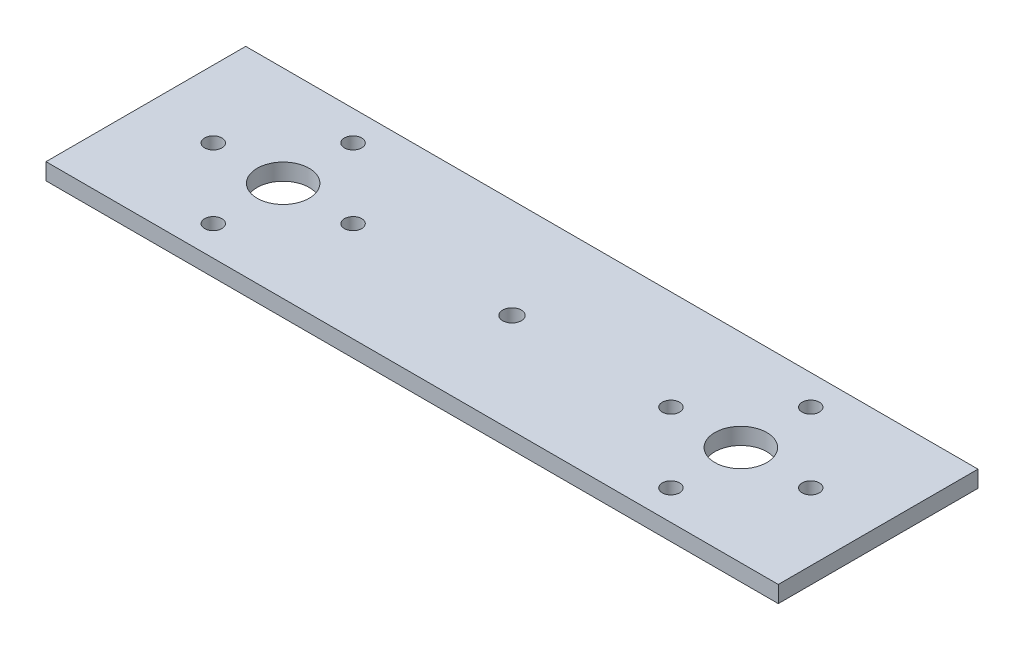
ISO-10303-21;
HEADER;
FILE_DESCRIPTION(('STEP AP214'),'2;1');
FILE_NAME('part.step','',(''),(''),'','','');
FILE_SCHEMA(('AUTOMOTIVE_DESIGN { 1 0 10303 214 1 1 1 1 }'));
ENDSEC;
DATA;
#1=APPLICATION_CONTEXT('core data for automotive mechanical design processes');
#2=APPLICATION_PROTOCOL_DEFINITION('international standard','automotive_design',2000,#1);
#3=PRODUCT_CONTEXT('',#1,'mechanical');
#4=PRODUCT('Part','Part','',(#3));
#5=PRODUCT_RELATED_PRODUCT_CATEGORY('part','',(#4));
#6=PRODUCT_DEFINITION_FORMATION('','',#4);
#7=PRODUCT_DEFINITION_CONTEXT('part definition',#1,'design');
#8=PRODUCT_DEFINITION('design','',#6,#7);
#9=PRODUCT_DEFINITION_SHAPE('','',#8);
#10=(LENGTH_UNIT() NAMED_UNIT(*) SI_UNIT(.MILLI.,.METRE.));
#11=(NAMED_UNIT(*) PLANE_ANGLE_UNIT() SI_UNIT($,.RADIAN.));
#12=(NAMED_UNIT(*) SI_UNIT($,.STERADIAN.) SOLID_ANGLE_UNIT());
#13=UNCERTAINTY_MEASURE_WITH_UNIT(LENGTH_MEASURE(1.E-05),#10,'distance_accuracy_value','');
#14=(GEOMETRIC_REPRESENTATION_CONTEXT(3) GLOBAL_UNCERTAINTY_ASSIGNED_CONTEXT((#13)) GLOBAL_UNIT_ASSIGNED_CONTEXT((#10,
#11,#12)) REPRESENTATION_CONTEXT('',''));
#15=CARTESIAN_POINT('',(0.,0.,0.));
#16=DIRECTION('',(0.,0.,1.));
#17=DIRECTION('',(1.,0.,0.));
#18=AXIS2_PLACEMENT_3D('',#15,#16,#17);
#19=CARTESIAN_POINT('',(139.7,6.35,38.1));
#20=DIRECTION('',(-1.,0.,0.));
#21=DIRECTION('',(0.,0.,1.));
#22=AXIS2_PLACEMENT_3D('',#19,#20,#21);
#23=PLANE('',#22);
#24=DIRECTION('',(0.,0.,-1.));
#25=VECTOR('',#24,1.);
#26=CARTESIAN_POINT('',(139.7,0.,38.1));
#27=LINE('',#26,#25);
#28=CARTESIAN_POINT('',(139.7,0.,38.1));
#29=VERTEX_POINT('',#28);
#30=CARTESIAN_POINT('',(139.7,0.,-38.1));
#31=VERTEX_POINT('',#30);
#32=EDGE_CURVE('E97',#29,#31,#27,.T.);
#33=ORIENTED_EDGE('',*,*,#32,.T.);
#34=DIRECTION('',(0.,-1.,0.));
#35=VECTOR('',#34,1.);
#36=CARTESIAN_POINT('',(139.7,6.35,-38.1));
#37=LINE('',#36,#35);
#38=CARTESIAN_POINT('',(139.7,6.35,-38.1));
#39=VERTEX_POINT('',#38);
#40=EDGE_CURVE('E11',#39,#31,#37,.T.);
#41=ORIENTED_EDGE('',*,*,#40,.F.);
#42=DIRECTION('',(0.,0.,-1.));
#43=VECTOR('',#42,1.);
#44=CARTESIAN_POINT('',(139.7,6.35,38.1));
#45=LINE('',#44,#43);
#46=CARTESIAN_POINT('',(139.7,6.35,38.1));
#47=VERTEX_POINT('',#46);
#48=EDGE_CURVE('E85',#47,#39,#45,.T.);
#49=ORIENTED_EDGE('',*,*,#48,.F.);
#50=DIRECTION('',(0.,-1.,0.));
#51=VECTOR('',#50,1.);
#52=CARTESIAN_POINT('',(139.7,6.35,38.1));
#53=LINE('',#52,#51);
#54=EDGE_CURVE('E93',#47,#29,#53,.T.);
#55=ORIENTED_EDGE('',*,*,#54,.T.);
#56=EDGE_LOOP('',(#33,#41,#49,#55));
#57=FACE_BOUND('',#56,.T.);
#58=ADVANCED_FACE('F34',(#57),#23,.F.);
#59=CARTESIAN_POINT('',(-139.7,6.35,-38.1));
#60=DIRECTION('',(0.,0.,1.));
#61=DIRECTION('',(1.,0.,0.));
#62=AXIS2_PLACEMENT_3D('',#59,#60,#61);
#63=PLANE('',#62);
#64=DIRECTION('',(-1.,0.,0.));
#65=VECTOR('',#64,1.);
#66=CARTESIAN_POINT('',(-139.7,0.,-38.1));
#67=LINE('',#66,#65);
#68=CARTESIAN_POINT('',(-139.7,0.,-38.1));
#69=VERTEX_POINT('',#68);
#70=EDGE_CURVE('E89',#31,#69,#67,.T.);
#71=ORIENTED_EDGE('',*,*,#70,.T.);
#72=DIRECTION('',(0.,-1.,0.));
#73=VECTOR('',#72,1.);
#74=CARTESIAN_POINT('',(-139.7,6.35,-38.1));
#75=LINE('',#74,#73);
#76=CARTESIAN_POINT('',(-139.7,6.35,-38.1));
#77=VERTEX_POINT('',#76);
#78=EDGE_CURVE('E42',#77,#69,#75,.T.);
#79=ORIENTED_EDGE('',*,*,#78,.F.);
#80=DIRECTION('',(-1.,0.,0.));
#81=VECTOR('',#80,1.);
#82=CARTESIAN_POINT('',(-139.7,6.35,-38.1));
#83=LINE('',#82,#81);
#84=EDGE_CURVE('E80',#39,#77,#83,.T.);
#85=ORIENTED_EDGE('',*,*,#84,.F.);
#86=ORIENTED_EDGE('',*,*,#40,.T.);
#87=EDGE_LOOP('',(#71,#79,#85,#86));
#88=FACE_BOUND('',#87,.T.);
#89=ADVANCED_FACE('F88',(#88),#63,.F.);
#90=CARTESIAN_POINT('',(-139.7,6.35,38.1));
#91=DIRECTION('',(1.,0.,0.));
#92=DIRECTION('',(0.,0.,-1.));
#93=AXIS2_PLACEMENT_3D('',#90,#91,#92);
#94=PLANE('',#93);
#95=DIRECTION('',(0.,0.,1.));
#96=VECTOR('',#95,1.);
#97=CARTESIAN_POINT('',(-139.7,0.,38.1));
#98=LINE('',#97,#96);
#99=CARTESIAN_POINT('',(-139.7,0.,38.1));
#100=VERTEX_POINT('',#99);
#101=EDGE_CURVE('E67',#69,#100,#98,.T.);
#102=ORIENTED_EDGE('',*,*,#101,.T.);
#103=DIRECTION('',(0.,-1.,0.));
#104=VECTOR('',#103,1.);
#105=CARTESIAN_POINT('',(-139.7,6.35,38.1));
#106=LINE('',#105,#104);
#107=CARTESIAN_POINT('',(-139.7,6.35,38.1));
#108=VERTEX_POINT('',#107);
#109=EDGE_CURVE('E90',#108,#100,#106,.T.);
#110=ORIENTED_EDGE('',*,*,#109,.F.);
#111=DIRECTION('',(0.,0.,1.));
#112=VECTOR('',#111,1.);
#113=CARTESIAN_POINT('',(-139.7,6.35,38.1));
#114=LINE('',#113,#112);
#115=EDGE_CURVE('E83',#77,#108,#114,.T.);
#116=ORIENTED_EDGE('',*,*,#115,.F.);
#117=ORIENTED_EDGE('',*,*,#78,.T.);
#118=EDGE_LOOP('',(#102,#110,#116,#117));
#119=FACE_BOUND('',#118,.T.);
#120=ADVANCED_FACE('F91',(#119),#94,.F.);
#121=CARTESIAN_POINT('',(-139.7,6.35,38.1));
#122=DIRECTION('',(0.,0.,-1.));
#123=DIRECTION('',(-1.,0.,0.));
#124=AXIS2_PLACEMENT_3D('',#121,#122,#123);
#125=PLANE('',#124);
#126=DIRECTION('',(1.,0.,0.));
#127=VECTOR('',#126,1.);
#128=CARTESIAN_POINT('',(-139.7,0.,38.1));
#129=LINE('',#128,#127);
#130=EDGE_CURVE('E73',#100,#29,#129,.T.);
#131=ORIENTED_EDGE('',*,*,#130,.T.);
#132=ORIENTED_EDGE('',*,*,#54,.F.);
#133=DIRECTION('',(1.,0.,0.));
#134=VECTOR('',#133,1.);
#135=CARTESIAN_POINT('',(-139.7,6.35,38.1));
#136=LINE('',#135,#134);
#137=EDGE_CURVE('E50',#108,#47,#136,.T.);
#138=ORIENTED_EDGE('',*,*,#137,.F.);
#139=ORIENTED_EDGE('',*,*,#109,.T.);
#140=EDGE_LOOP('',(#131,#132,#138,#139));
#141=FACE_BOUND('',#140,.T.);
#142=ADVANCED_FACE('F105',(#141),#125,.F.);
#143=CARTESIAN_POINT('',(0.,6.35,0.));
#144=DIRECTION('',(0.,-1.,0.));
#145=DIRECTION('',(0.,0.,-1.));
#146=AXIS2_PLACEMENT_3D('',#143,#144,#145);
#147=PLANE('',#146);
#148=CARTESIAN_POINT('',(0.,6.35,0.));
#149=DIRECTION('',(0.,-1.,0.));
#150=DIRECTION('',(0.,0.,-1.));
#151=AXIS2_PLACEMENT_3D('',#148,#149,#150);
#152=CIRCLE('',#151,3.556);
#153=CARTESIAN_POINT('',(0.,6.35,-3.556));
#154=VERTEX_POINT('',#153);
#155=EDGE_CURVE('E151',#154,#154,#152,.T.);
#156=ORIENTED_EDGE('',*,*,#155,.T.);
#157=EDGE_LOOP('',(#156));
#158=FACE_BOUND('',#157,.T.);
#159=CARTESIAN_POINT('',(-60.6425,6.35,0.));
#160=DIRECTION('',(0.,-1.,0.));
#161=DIRECTION('',(0.,0.,1.));
#162=AXIS2_PLACEMENT_3D('',#159,#160,#161);
#163=CIRCLE('',#162,3.302);
#164=CARTESIAN_POINT('',(-60.6425,6.35,3.302));
#165=VERTEX_POINT('',#164);
#166=EDGE_CURVE('E166',#165,#165,#163,.T.);
#167=ORIENTED_EDGE('',*,*,#166,.T.);
#168=EDGE_LOOP('',(#167));
#169=FACE_BOUND('',#168,.T.);
#170=CARTESIAN_POINT('',(-87.3125000000001,6.35,26.67));
#171=DIRECTION('',(0.,-1.,0.));
#172=DIRECTION('',(-1.,0.,0.));
#173=AXIS2_PLACEMENT_3D('',#170,#171,#172);
#174=CIRCLE('',#173,3.302);
#175=CARTESIAN_POINT('',(-90.6145000000001,6.35,26.67));
#176=VERTEX_POINT('',#175);
#177=EDGE_CURVE('E160',#176,#176,#174,.T.);
#178=ORIENTED_EDGE('',*,*,#177,.T.);
#179=EDGE_LOOP('',(#178));
#180=FACE_BOUND('',#179,.T.);
#181=CARTESIAN_POINT('',(-113.9825,6.35,0.));
#182=DIRECTION('',(0.,-1.,0.));
#183=DIRECTION('',(0.,0.,-1.));
#184=AXIS2_PLACEMENT_3D('',#181,#182,#183);
#185=CIRCLE('',#184,3.302);
#186=CARTESIAN_POINT('',(-113.9825,6.35,-3.302));
#187=VERTEX_POINT('',#186);
#188=EDGE_CURVE('E154',#187,#187,#185,.T.);
#189=ORIENTED_EDGE('',*,*,#188,.T.);
#190=EDGE_LOOP('',(#189));
#191=FACE_BOUND('',#190,.T.);
#192=CARTESIAN_POINT('',(-87.3124999999997,6.35,-26.67));
#193=DIRECTION('',(0.,-1.,0.));
#194=DIRECTION('',(1.,0.,0.));
#195=AXIS2_PLACEMENT_3D('',#192,#193,#194);
#196=CIRCLE('',#195,3.302);
#197=CARTESIAN_POINT('',(-84.0104999999997,6.35,-26.67));
#198=VERTEX_POINT('',#197);
#199=EDGE_CURVE('E147',#198,#198,#196,.T.);
#200=ORIENTED_EDGE('',*,*,#199,.T.);
#201=EDGE_LOOP('',(#200));
#202=FACE_BOUND('',#201,.T.);
#203=CARTESIAN_POINT('',(-87.3125,6.35,0.));
#204=DIRECTION('',(0.,1.,0.));
#205=DIRECTION('',(0.,0.,1.));
#206=AXIS2_PLACEMENT_3D('',#203,#204,#205);
#207=CIRCLE('',#206,9.921875);
#208=CARTESIAN_POINT('',(-87.3125,6.35,9.921875));
#209=VERTEX_POINT('',#208);
#210=EDGE_CURVE('E143',#209,#209,#207,.T.);
#211=ORIENTED_EDGE('',*,*,#210,.F.);
#212=EDGE_LOOP('',(#211));
#213=FACE_BOUND('',#212,.T.);
#214=CARTESIAN_POINT('',(87.3125000000001,6.35,26.67));
#215=DIRECTION('',(0.,1.,0.));
#216=DIRECTION('',(1.,0.,0.));
#217=AXIS2_PLACEMENT_3D('',#214,#215,#216);
#218=CIRCLE('',#217,3.302);
#219=CARTESIAN_POINT('',(90.6145000000001,6.35,26.67));
#220=VERTEX_POINT('',#219);
#221=EDGE_CURVE('E136',#220,#220,#218,.T.);
#222=ORIENTED_EDGE('',*,*,#221,.F.);
#223=EDGE_LOOP('',(#222));
#224=FACE_BOUND('',#223,.T.);
#225=CARTESIAN_POINT('',(113.9825,6.35,0.));
#226=DIRECTION('',(0.,1.,0.));
#227=DIRECTION('',(0.,0.,-1.));
#228=AXIS2_PLACEMENT_3D('',#225,#226,#227);
#229=CIRCLE('',#228,3.302);
#230=CARTESIAN_POINT('',(113.9825,6.35,-3.302));
#231=VERTEX_POINT('',#230);
#232=EDGE_CURVE('E130',#231,#231,#229,.T.);
#233=ORIENTED_EDGE('',*,*,#232,.F.);
#234=EDGE_LOOP('',(#233));
#235=FACE_BOUND('',#234,.T.);
#236=CARTESIAN_POINT('',(87.3124999999997,6.35,-26.67));
#237=DIRECTION('',(0.,1.,0.));
#238=DIRECTION('',(-1.,0.,0.));
#239=AXIS2_PLACEMENT_3D('',#236,#237,#238);
#240=CIRCLE('',#239,3.302);
#241=CARTESIAN_POINT('',(84.0104999999997,6.35,-26.67));
#242=VERTEX_POINT('',#241);
#243=EDGE_CURVE('E123',#242,#242,#240,.T.);
#244=ORIENTED_EDGE('',*,*,#243,.F.);
#245=EDGE_LOOP('',(#244));
#246=FACE_BOUND('',#245,.T.);
#247=CARTESIAN_POINT('',(60.6425,6.35,0.));
#248=DIRECTION('',(0.,1.,0.));
#249=DIRECTION('',(0.,0.,1.));
#250=AXIS2_PLACEMENT_3D('',#247,#248,#249);
#251=CIRCLE('',#250,3.302);
#252=CARTESIAN_POINT('',(60.6425,6.35,3.302));
#253=VERTEX_POINT('',#252);
#254=EDGE_CURVE('E117',#253,#253,#251,.T.);
#255=ORIENTED_EDGE('',*,*,#254,.F.);
#256=EDGE_LOOP('',(#255));
#257=FACE_BOUND('',#256,.T.);
#258=CARTESIAN_POINT('',(87.3125,6.35,0.));
#259=DIRECTION('',(0.,1.,0.));
#260=DIRECTION('',(0.,0.,1.));
#261=AXIS2_PLACEMENT_3D('',#258,#259,#260);
#262=CIRCLE('',#261,9.921875);
#263=CARTESIAN_POINT('',(87.3125,6.35,9.921875));
#264=VERTEX_POINT('',#263);
#265=EDGE_CURVE('E113',#264,#264,#262,.T.);
#266=ORIENTED_EDGE('',*,*,#265,.F.);
#267=EDGE_LOOP('',(#266));
#268=FACE_BOUND('',#267,.T.);
#269=ORIENTED_EDGE('',*,*,#48,.T.);
#270=ORIENTED_EDGE('',*,*,#84,.T.);
#271=ORIENTED_EDGE('',*,*,#115,.T.);
#272=ORIENTED_EDGE('',*,*,#137,.T.);
#273=EDGE_LOOP('',(#269,#270,#271,#272));
#274=FACE_BOUND('',#273,.T.);
#275=ADVANCED_FACE('F81',(#158,#169,#180,#191,#202,#213,#224,#235,#246,#257,#268,#274),#147,.F.);
#276=CARTESIAN_POINT('',(0.,0.,0.));
#277=DIRECTION('',(0.,-1.,0.));
#278=DIRECTION('',(0.,0.,-1.));
#279=AXIS2_PLACEMENT_3D('',#276,#277,#278);
#280=PLANE('',#279);
#281=CARTESIAN_POINT('',(0.,0.,0.));
#282=DIRECTION('',(0.,-1.,0.));
#283=DIRECTION('',(0.,0.,-1.));
#284=AXIS2_PLACEMENT_3D('',#281,#282,#283);
#285=CIRCLE('',#284,3.556);
#286=CARTESIAN_POINT('',(0.,0.,-3.556));
#287=VERTEX_POINT('',#286);
#288=EDGE_CURVE('E171',#287,#287,#285,.T.);
#289=ORIENTED_EDGE('',*,*,#288,.F.);
#290=EDGE_LOOP('',(#289));
#291=FACE_BOUND('',#290,.T.);
#292=CARTESIAN_POINT('',(-60.6425,0.,0.));
#293=DIRECTION('',(0.,-1.,0.));
#294=DIRECTION('',(0.,0.,1.));
#295=AXIS2_PLACEMENT_3D('',#292,#293,#294);
#296=CIRCLE('',#295,3.302);
#297=CARTESIAN_POINT('',(-60.6425,0.,3.302));
#298=VERTEX_POINT('',#297);
#299=EDGE_CURVE('E146',#298,#298,#296,.T.);
#300=ORIENTED_EDGE('',*,*,#299,.F.);
#301=EDGE_LOOP('',(#300));
#302=FACE_BOUND('',#301,.T.);
#303=CARTESIAN_POINT('',(-87.3125000000001,0.,26.67));
#304=DIRECTION('',(0.,-1.,0.));
#305=DIRECTION('',(-1.,0.,0.));
#306=AXIS2_PLACEMENT_3D('',#303,#304,#305);
#307=CIRCLE('',#306,3.302);
#308=CARTESIAN_POINT('',(-90.6145000000001,0.,26.67));
#309=VERTEX_POINT('',#308);
#310=EDGE_CURVE('E163',#309,#309,#307,.T.);
#311=ORIENTED_EDGE('',*,*,#310,.F.);
#312=EDGE_LOOP('',(#311));
#313=FACE_BOUND('',#312,.T.);
#314=CARTESIAN_POINT('',(-113.9825,0.,0.));
#315=DIRECTION('',(0.,-1.,0.));
#316=DIRECTION('',(0.,0.,-1.));
#317=AXIS2_PLACEMENT_3D('',#314,#315,#316);
#318=CIRCLE('',#317,3.302);
#319=CARTESIAN_POINT('',(-113.9825,0.,-3.302));
#320=VERTEX_POINT('',#319);
#321=EDGE_CURVE('E157',#320,#320,#318,.T.);
#322=ORIENTED_EDGE('',*,*,#321,.F.);
#323=EDGE_LOOP('',(#322));
#324=FACE_BOUND('',#323,.T.);
#325=CARTESIAN_POINT('',(-87.3124999999997,0.,-26.67));
#326=DIRECTION('',(0.,-1.,0.));
#327=DIRECTION('',(1.,0.,0.));
#328=AXIS2_PLACEMENT_3D('',#325,#326,#327);
#329=CIRCLE('',#328,3.302);
#330=CARTESIAN_POINT('',(-84.0104999999997,0.,-26.67));
#331=VERTEX_POINT('',#330);
#332=EDGE_CURVE('E150',#331,#331,#329,.T.);
#333=ORIENTED_EDGE('',*,*,#332,.F.);
#334=EDGE_LOOP('',(#333));
#335=FACE_BOUND('',#334,.T.);
#336=CARTESIAN_POINT('',(-87.3125,0.,0.));
#337=DIRECTION('',(0.,1.,0.));
#338=DIRECTION('',(0.,0.,1.));
#339=AXIS2_PLACEMENT_3D('',#336,#337,#338);
#340=CIRCLE('',#339,9.921875);
#341=CARTESIAN_POINT('',(-87.3125,0.,9.921875));
#342=VERTEX_POINT('',#341);
#343=EDGE_CURVE('E127',#342,#342,#340,.T.);
#344=ORIENTED_EDGE('',*,*,#343,.T.);
#345=EDGE_LOOP('',(#344));
#346=FACE_BOUND('',#345,.T.);
#347=CARTESIAN_POINT('',(87.3125000000001,0.,26.67));
#348=DIRECTION('',(0.,1.,0.));
#349=DIRECTION('',(1.,0.,0.));
#350=AXIS2_PLACEMENT_3D('',#347,#348,#349);
#351=CIRCLE('',#350,3.302);
#352=CARTESIAN_POINT('',(90.6145000000001,0.,26.67));
#353=VERTEX_POINT('',#352);
#354=EDGE_CURVE('E120',#353,#353,#351,.T.);
#355=ORIENTED_EDGE('',*,*,#354,.T.);
#356=EDGE_LOOP('',(#355));
#357=FACE_BOUND('',#356,.T.);
#358=CARTESIAN_POINT('',(113.9825,0.,0.));
#359=DIRECTION('',(0.,1.,0.));
#360=DIRECTION('',(0.,0.,-1.));
#361=AXIS2_PLACEMENT_3D('',#358,#359,#360);
#362=CIRCLE('',#361,3.302);
#363=CARTESIAN_POINT('',(113.9825,0.,-3.302));
#364=VERTEX_POINT('',#363);
#365=EDGE_CURVE('E133',#364,#364,#362,.T.);
#366=ORIENTED_EDGE('',*,*,#365,.T.);
#367=EDGE_LOOP('',(#366));
#368=FACE_BOUND('',#367,.T.);
#369=CARTESIAN_POINT('',(87.3124999999997,0.,-26.67));
#370=DIRECTION('',(0.,1.,0.));
#371=DIRECTION('',(-1.,0.,0.));
#372=AXIS2_PLACEMENT_3D('',#369,#370,#371);
#373=CIRCLE('',#372,3.302);
#374=CARTESIAN_POINT('',(84.0104999999997,0.,-26.67));
#375=VERTEX_POINT('',#374);
#376=EDGE_CURVE('E126',#375,#375,#373,.T.);
#377=ORIENTED_EDGE('',*,*,#376,.T.);
#378=EDGE_LOOP('',(#377));
#379=FACE_BOUND('',#378,.T.);
#380=CARTESIAN_POINT('',(60.6425,0.,0.));
#381=DIRECTION('',(0.,1.,0.));
#382=DIRECTION('',(0.,0.,1.));
#383=AXIS2_PLACEMENT_3D('',#380,#381,#382);
#384=CIRCLE('',#383,3.302);
#385=CARTESIAN_POINT('',(60.6425,0.,3.302));
#386=VERTEX_POINT('',#385);
#387=EDGE_CURVE('E116',#386,#386,#384,.T.);
#388=ORIENTED_EDGE('',*,*,#387,.T.);
#389=EDGE_LOOP('',(#388));
#390=FACE_BOUND('',#389,.T.);
#391=CARTESIAN_POINT('',(87.3125,0.,0.));
#392=DIRECTION('',(0.,1.,0.));
#393=DIRECTION('',(0.,0.,1.));
#394=AXIS2_PLACEMENT_3D('',#391,#392,#393);
#395=CIRCLE('',#394,9.921875);
#396=CARTESIAN_POINT('',(87.3125,0.,9.921875));
#397=VERTEX_POINT('',#396);
#398=EDGE_CURVE('E100',#397,#397,#395,.T.);
#399=ORIENTED_EDGE('',*,*,#398,.T.);
#400=EDGE_LOOP('',(#399));
#401=FACE_BOUND('',#400,.T.);
#402=ORIENTED_EDGE('',*,*,#32,.F.);
#403=ORIENTED_EDGE('',*,*,#130,.F.);
#404=ORIENTED_EDGE('',*,*,#101,.F.);
#405=ORIENTED_EDGE('',*,*,#70,.F.);
#406=EDGE_LOOP('',(#402,#403,#404,#405));
#407=FACE_BOUND('',#406,.T.);
#408=ADVANCED_FACE('F108',(#291,#302,#313,#324,#335,#346,#357,#368,#379,#390,#401,#407),#280,.T.);
#409=CARTESIAN_POINT('',(87.3125,6.35,0.));
#410=DIRECTION('',(0.,1.,0.));
#411=DIRECTION('',(0.,0.,1.));
#412=AXIS2_PLACEMENT_3D('',#409,#410,#411);
#413=CYLINDRICAL_SURFACE('',#412,9.921875);
#414=ORIENTED_EDGE('',*,*,#398,.F.);
#415=EDGE_LOOP('',(#414));
#416=FACE_BOUND('',#415,.T.);
#417=ORIENTED_EDGE('',*,*,#265,.T.);
#418=EDGE_LOOP('',(#417));
#419=FACE_BOUND('',#418,.T.);
#420=ADVANCED_FACE('F188',(#416,#419),#413,.F.);
#421=CARTESIAN_POINT('',(60.6425,0.,0.));
#422=DIRECTION('',(0.,1.,0.));
#423=DIRECTION('',(0.,0.,1.));
#424=AXIS2_PLACEMENT_3D('',#421,#422,#423);
#425=CYLINDRICAL_SURFACE('',#424,3.302);
#426=ORIENTED_EDGE('',*,*,#387,.F.);
#427=EDGE_LOOP('',(#426));
#428=FACE_BOUND('',#427,.T.);
#429=ORIENTED_EDGE('',*,*,#254,.T.);
#430=EDGE_LOOP('',(#429));
#431=FACE_BOUND('',#430,.T.);
#432=ADVANCED_FACE('F212',(#428,#431),#425,.F.);
#433=CARTESIAN_POINT('',(87.3124999999997,0.,-26.67));
#434=DIRECTION('',(0.,1.,0.));
#435=DIRECTION('',(0.,0.,1.));
#436=AXIS2_PLACEMENT_3D('',#433,#434,#435);
#437=CYLINDRICAL_SURFACE('',#436,3.302);
#438=ORIENTED_EDGE('',*,*,#376,.F.);
#439=EDGE_LOOP('',(#438));
#440=FACE_BOUND('',#439,.T.);
#441=ORIENTED_EDGE('',*,*,#243,.T.);
#442=EDGE_LOOP('',(#441));
#443=FACE_BOUND('',#442,.T.);
#444=ADVANCED_FACE('F253',(#440,#443),#437,.F.);
#445=CARTESIAN_POINT('',(113.9825,0.,0.));
#446=DIRECTION('',(0.,1.,0.));
#447=DIRECTION('',(0.,0.,1.));
#448=AXIS2_PLACEMENT_3D('',#445,#446,#447);
#449=CYLINDRICAL_SURFACE('',#448,3.302);
#450=ORIENTED_EDGE('',*,*,#365,.F.);
#451=EDGE_LOOP('',(#450));
#452=FACE_BOUND('',#451,.T.);
#453=ORIENTED_EDGE('',*,*,#232,.T.);
#454=EDGE_LOOP('',(#453));
#455=FACE_BOUND('',#454,.T.);
#456=ADVANCED_FACE('F263',(#452,#455),#449,.F.);
#457=CARTESIAN_POINT('',(87.3125000000001,0.,26.67));
#458=DIRECTION('',(0.,1.,0.));
#459=DIRECTION('',(0.,0.,1.));
#460=AXIS2_PLACEMENT_3D('',#457,#458,#459);
#461=CYLINDRICAL_SURFACE('',#460,3.302);
#462=ORIENTED_EDGE('',*,*,#354,.F.);
#463=EDGE_LOOP('',(#462));
#464=FACE_BOUND('',#463,.T.);
#465=ORIENTED_EDGE('',*,*,#221,.T.);
#466=EDGE_LOOP('',(#465));
#467=FACE_BOUND('',#466,.T.);
#468=ADVANCED_FACE('F273',(#464,#467),#461,.F.);
#469=CARTESIAN_POINT('',(-87.3125,6.35,0.));
#470=DIRECTION('',(0.,1.,0.));
#471=DIRECTION('',(0.,0.,1.));
#472=AXIS2_PLACEMENT_3D('',#469,#470,#471);
#473=CYLINDRICAL_SURFACE('',#472,9.921875);
#474=ORIENTED_EDGE('',*,*,#343,.F.);
#475=EDGE_LOOP('',(#474));
#476=FACE_BOUND('',#475,.T.);
#477=ORIENTED_EDGE('',*,*,#210,.T.);
#478=EDGE_LOOP('',(#477));
#479=FACE_BOUND('',#478,.T.);
#480=ADVANCED_FACE('F283',(#476,#479),#473,.F.);
#481=CARTESIAN_POINT('',(-87.3124999999997,0.,-26.67));
#482=DIRECTION('',(0.,1.,0.));
#483=DIRECTION('',(0.,0.,1.));
#484=AXIS2_PLACEMENT_3D('',#481,#482,#483);
#485=CYLINDRICAL_SURFACE('',#484,3.302);
#486=ORIENTED_EDGE('',*,*,#332,.T.);
#487=EDGE_LOOP('',(#486));
#488=FACE_BOUND('',#487,.T.);
#489=ORIENTED_EDGE('',*,*,#199,.F.);
#490=EDGE_LOOP('',(#489));
#491=FACE_BOUND('',#490,.T.);
#492=ADVANCED_FACE('F293',(#488,#491),#485,.F.);
#493=CARTESIAN_POINT('',(-113.9825,0.,0.));
#494=DIRECTION('',(0.,1.,0.));
#495=DIRECTION('',(0.,0.,1.));
#496=AXIS2_PLACEMENT_3D('',#493,#494,#495);
#497=CYLINDRICAL_SURFACE('',#496,3.302);
#498=ORIENTED_EDGE('',*,*,#321,.T.);
#499=EDGE_LOOP('',(#498));
#500=FACE_BOUND('',#499,.T.);
#501=ORIENTED_EDGE('',*,*,#188,.F.);
#502=EDGE_LOOP('',(#501));
#503=FACE_BOUND('',#502,.T.);
#504=ADVANCED_FACE('F303',(#500,#503),#497,.F.);
#505=CARTESIAN_POINT('',(-87.3125000000001,0.,26.67));
#506=DIRECTION('',(0.,1.,0.));
#507=DIRECTION('',(0.,0.,1.));
#508=AXIS2_PLACEMENT_3D('',#505,#506,#507);
#509=CYLINDRICAL_SURFACE('',#508,3.302);
#510=ORIENTED_EDGE('',*,*,#310,.T.);
#511=EDGE_LOOP('',(#510));
#512=FACE_BOUND('',#511,.T.);
#513=ORIENTED_EDGE('',*,*,#177,.F.);
#514=EDGE_LOOP('',(#513));
#515=FACE_BOUND('',#514,.T.);
#516=ADVANCED_FACE('F313',(#512,#515),#509,.F.);
#517=CARTESIAN_POINT('',(-60.6425,0.,0.));
#518=DIRECTION('',(0.,1.,0.));
#519=DIRECTION('',(0.,0.,1.));
#520=AXIS2_PLACEMENT_3D('',#517,#518,#519);
#521=CYLINDRICAL_SURFACE('',#520,3.302);
#522=ORIENTED_EDGE('',*,*,#299,.T.);
#523=EDGE_LOOP('',(#522));
#524=FACE_BOUND('',#523,.T.);
#525=ORIENTED_EDGE('',*,*,#166,.F.);
#526=EDGE_LOOP('',(#525));
#527=FACE_BOUND('',#526,.T.);
#528=ADVANCED_FACE('F182',(#524,#527),#521,.F.);
#529=CARTESIAN_POINT('',(0.,6.35,0.));
#530=DIRECTION('',(0.,-1.,0.));
#531=DIRECTION('',(0.,0.,-1.));
#532=AXIS2_PLACEMENT_3D('',#529,#530,#531);
#533=CYLINDRICAL_SURFACE('',#532,3.556);
#534=ORIENTED_EDGE('',*,*,#155,.F.);
#535=EDGE_LOOP('',(#534));
#536=FACE_BOUND('',#535,.T.);
#537=ORIENTED_EDGE('',*,*,#288,.T.);
#538=EDGE_LOOP('',(#537));
#539=FACE_BOUND('',#538,.T.);
#540=ADVANCED_FACE('F179',(#536,#539),#533,.F.);
#541=CLOSED_SHELL('',(#58,#89,#120,#142,#275,#408,#420,#432,#444,#456,#468,#480,#492,#504,#516,
#528,#540));
#542=MANIFOLD_SOLID_BREP('B2',#541);
#543=ADVANCED_BREP_SHAPE_REPRESENTATION('',(#18,#542),#14);
#544=SHAPE_DEFINITION_REPRESENTATION(#9,#543);
ENDSEC;
END-ISO-10303-21;
